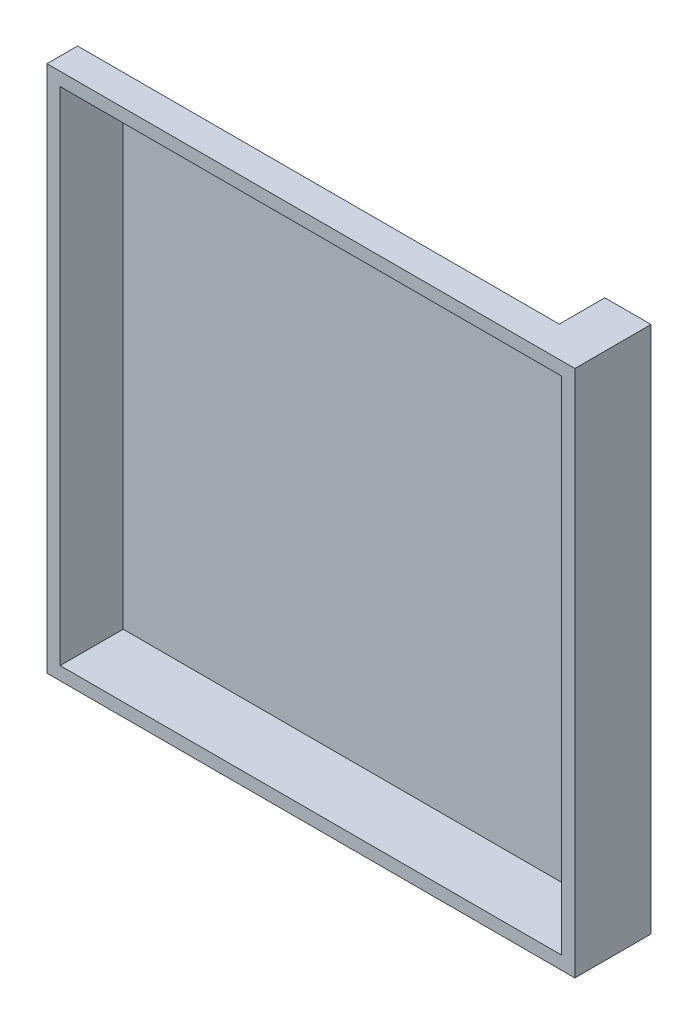
ISO-10303-21;
HEADER;
FILE_DESCRIPTION(('STEP AP214'),'2;1');
FILE_NAME('part.step','',(''),(''),'','','');
FILE_SCHEMA(('AUTOMOTIVE_DESIGN { 1 0 10303 214 1 1 1 1 }'));
ENDSEC;
DATA;
#1=APPLICATION_CONTEXT('core data for automotive mechanical design processes');
#2=APPLICATION_PROTOCOL_DEFINITION('international standard','automotive_design',2000,#1);
#3=PRODUCT_CONTEXT('',#1,'mechanical');
#4=PRODUCT('Part','Part','',(#3));
#5=PRODUCT_RELATED_PRODUCT_CATEGORY('part','',(#4));
#6=PRODUCT_DEFINITION_FORMATION('','',#4);
#7=PRODUCT_DEFINITION_CONTEXT('part definition',#1,'design');
#8=PRODUCT_DEFINITION('design','',#6,#7);
#9=PRODUCT_DEFINITION_SHAPE('','',#8);
#10=(LENGTH_UNIT() NAMED_UNIT(*) SI_UNIT(.MILLI.,.METRE.));
#11=(NAMED_UNIT(*) PLANE_ANGLE_UNIT() SI_UNIT($,.RADIAN.));
#12=(NAMED_UNIT(*) SI_UNIT($,.STERADIAN.) SOLID_ANGLE_UNIT());
#13=UNCERTAINTY_MEASURE_WITH_UNIT(LENGTH_MEASURE(1.E-05),#10,'distance_accuracy_value','');
#14=(GEOMETRIC_REPRESENTATION_CONTEXT(3) GLOBAL_UNCERTAINTY_ASSIGNED_CONTEXT((#13)) GLOBAL_UNIT_ASSIGNED_CONTEXT((#10,
#11,#12)) REPRESENTATION_CONTEXT('',''));
#15=CARTESIAN_POINT('',(0.,0.,0.));
#16=DIRECTION('',(0.,0.,1.));
#17=DIRECTION('',(1.,0.,0.));
#18=AXIS2_PLACEMENT_3D('',#15,#16,#17);
#19=CARTESIAN_POINT('',(-200.,-190.,1200.));
#20=DIRECTION('',(0.,1.,0.));
#21=DIRECTION('',(0.,0.,1.));
#22=AXIS2_PLACEMENT_3D('',#19,#20,#21);
#23=PLANE('',#22);
#24=DIRECTION('',(0.,0.,-1.));
#25=VECTOR('',#24,1.);
#26=CARTESIAN_POINT('',(190.,-190.,1200.));
#27=LINE('',#26,#25);
#28=CARTESIAN_POINT('',(190.,-190.,1200.));
#29=VERTEX_POINT('',#28);
#30=CARTESIAN_POINT('',(190.,-190.,1152.26497308104));
#31=VERTEX_POINT('',#30);
#32=EDGE_CURVE('E136',#29,#31,#27,.T.);
#33=ORIENTED_EDGE('',*,*,#32,.T.);
#34=DIRECTION('',(-1.,0.,0.));
#35=VECTOR('',#34,1.);
#36=CARTESIAN_POINT('',(-200.,-190.,1152.26497308104));
#37=LINE('',#36,#35);
#38=CARTESIAN_POINT('',(-190.,-190.,1152.26497308104));
#39=VERTEX_POINT('',#38);
#40=EDGE_CURVE('E145',#31,#39,#37,.T.);
#41=ORIENTED_EDGE('',*,*,#40,.T.);
#42=DIRECTION('',(0.,0.,-1.));
#43=VECTOR('',#42,1.);
#44=CARTESIAN_POINT('',(-190.,-190.,1200.));
#45=LINE('',#44,#43);
#46=CARTESIAN_POINT('',(-190.,-190.,1200.));
#47=VERTEX_POINT('',#46);
#48=EDGE_CURVE('E50',#47,#39,#45,.T.);
#49=ORIENTED_EDGE('',*,*,#48,.F.);
#50=DIRECTION('',(1.,0.,0.));
#51=VECTOR('',#50,1.);
#52=CARTESIAN_POINT('',(-200.,-190.,1200.));
#53=LINE('',#52,#51);
#54=EDGE_CURVE('E151',#47,#29,#53,.T.);
#55=ORIENTED_EDGE('',*,*,#54,.T.);
#56=EDGE_LOOP('',(#33,#41,#49,#55));
#57=FACE_BOUND('',#56,.T.);
#58=ADVANCED_FACE('F35',(#57),#23,.T.);
#59=CARTESIAN_POINT('',(190.,200.,1200.));
#60=DIRECTION('',(-1.,0.,0.));
#61=DIRECTION('',(0.,-1.,0.));
#62=AXIS2_PLACEMENT_3D('',#59,#60,#61);
#63=PLANE('',#62);
#64=DIRECTION('',(0.,1.,0.));
#65=VECTOR('',#64,1.);
#66=CARTESIAN_POINT('',(190.,200.,1152.26497308104));
#67=LINE('',#66,#65);
#68=CARTESIAN_POINT('',(190.,190.,1152.26497308104));
#69=VERTEX_POINT('',#68);
#70=EDGE_CURVE('E132',#31,#69,#67,.T.);
#71=ORIENTED_EDGE('',*,*,#70,.F.);
#72=ORIENTED_EDGE('',*,*,#32,.F.);
#73=DIRECTION('',(0.,1.,0.));
#74=VECTOR('',#73,1.);
#75=CARTESIAN_POINT('',(190.,200.,1200.));
#76=LINE('',#75,#74);
#77=CARTESIAN_POINT('',(190.,190.,1200.));
#78=VERTEX_POINT('',#77);
#79=EDGE_CURVE('E142',#29,#78,#76,.T.);
#80=ORIENTED_EDGE('',*,*,#79,.T.);
#81=DIRECTION('',(0.,0.,-1.));
#82=VECTOR('',#81,1.);
#83=CARTESIAN_POINT('',(190.,190.,1200.));
#84=LINE('',#83,#82);
#85=EDGE_CURVE('E139',#78,#69,#84,.T.);
#86=ORIENTED_EDGE('',*,*,#85,.T.);
#87=EDGE_LOOP('',(#71,#72,#80,#86));
#88=FACE_BOUND('',#87,.T.);
#89=ADVANCED_FACE('F134',(#88),#63,.T.);
#90=CARTESIAN_POINT('',(-190.,200.,1200.));
#91=DIRECTION('',(1.,0.,0.));
#92=DIRECTION('',(0.,1.,0.));
#93=AXIS2_PLACEMENT_3D('',#90,#91,#92);
#94=PLANE('',#93);
#95=ORIENTED_EDGE('',*,*,#48,.T.);
#96=DIRECTION('',(0.,1.,0.));
#97=VECTOR('',#96,1.);
#98=CARTESIAN_POINT('',(-190.,-100.,1152.26497308104));
#99=LINE('',#98,#97);
#100=CARTESIAN_POINT('',(-190.,155.265246170202,1152.26497308104));
#101=VERTEX_POINT('',#100);
#102=EDGE_CURVE('E143',#39,#101,#99,.T.);
#103=ORIENTED_EDGE('',*,*,#102,.T.);
#104=CARTESIAN_POINT('',(-190.,206.5,1132.26497308104));
#105=DIRECTION('',(1.,0.,0.));
#106=DIRECTION('',(0.,1.,0.));
#107=AXIS2_PLACEMENT_3D('',#104,#105,#106);
#108=CIRCLE('',#107,55.);
#109=CARTESIAN_POINT('',(-190.,190.,1184.73162915897));
#110=VERTEX_POINT('',#109);
#111=EDGE_CURVE('E161',#110,#101,#108,.T.);
#112=ORIENTED_EDGE('',*,*,#111,.F.);
#113=DIRECTION('',(0.,0.,-1.));
#114=VECTOR('',#113,1.);
#115=CARTESIAN_POINT('',(-190.,190.,1200.));
#116=LINE('',#115,#114);
#117=CARTESIAN_POINT('',(-190.,190.,1200.));
#118=VERTEX_POINT('',#117);
#119=EDGE_CURVE('E153',#118,#110,#116,.T.);
#120=ORIENTED_EDGE('',*,*,#119,.F.);
#121=DIRECTION('',(0.,-1.,0.));
#122=VECTOR('',#121,1.);
#123=CARTESIAN_POINT('',(-190.,200.,1200.));
#124=LINE('',#123,#122);
#125=EDGE_CURVE('E155',#118,#47,#124,.T.);
#126=ORIENTED_EDGE('',*,*,#125,.T.);
#127=EDGE_LOOP('',(#95,#103,#112,#120,#126));
#128=FACE_BOUND('',#127,.T.);
#129=ADVANCED_FACE('F260',(#128),#94,.T.);
#130=CARTESIAN_POINT('',(-200.,-200.,1200.));
#131=DIRECTION('',(0.,1.,0.));
#132=DIRECTION('',(0.,0.,1.));
#133=AXIS2_PLACEMENT_3D('',#130,#131,#132);
#134=PLANE('',#133);
#135=DIRECTION('',(0.,0.,-1.));
#136=VECTOR('',#135,1.);
#137=CARTESIAN_POINT('',(-200.,-200.,1200.));
#138=LINE('',#137,#136);
#139=CARTESIAN_POINT('',(-200.,-200.,1200.));
#140=VERTEX_POINT('',#139);
#141=CARTESIAN_POINT('',(-200.,-200.,1142.26497308104));
#142=VERTEX_POINT('',#141);
#143=EDGE_CURVE('E216',#140,#142,#138,.T.);
#144=ORIENTED_EDGE('',*,*,#143,.T.);
#145=DIRECTION('',(-1.,0.,0.));
#146=VECTOR('',#145,1.);
#147=CARTESIAN_POINT('',(-200.,-200.,1142.26497308104));
#148=LINE('',#147,#146);
#149=CARTESIAN_POINT('',(200.,-200.,1142.26497308104));
#150=VERTEX_POINT('',#149);
#151=EDGE_CURVE('E148',#150,#142,#148,.T.);
#152=ORIENTED_EDGE('',*,*,#151,.F.);
#153=DIRECTION('',(0.,0.,-1.));
#154=VECTOR('',#153,1.);
#155=CARTESIAN_POINT('',(200.,-200.,1200.));
#156=LINE('',#155,#154);
#157=CARTESIAN_POINT('',(200.,-200.,1200.));
#158=VERTEX_POINT('',#157);
#159=EDGE_CURVE('E213',#158,#150,#156,.T.);
#160=ORIENTED_EDGE('',*,*,#159,.F.);
#161=DIRECTION('',(1.,0.,0.));
#162=VECTOR('',#161,1.);
#163=CARTESIAN_POINT('',(-200.,-200.,1200.));
#164=LINE('',#163,#162);
#165=EDGE_CURVE('E211',#140,#158,#164,.T.);
#166=ORIENTED_EDGE('',*,*,#165,.F.);
#167=EDGE_LOOP('',(#144,#152,#160,#166));
#168=FACE_BOUND('',#167,.T.);
#169=ADVANCED_FACE('F258',(#168),#134,.F.);
#170=CARTESIAN_POINT('',(200.,200.,1200.));
#171=DIRECTION('',(-1.,0.,0.));
#172=DIRECTION('',(0.,-1.,0.));
#173=AXIS2_PLACEMENT_3D('',#170,#171,#172);
#174=PLANE('',#173);
#175=ORIENTED_EDGE('',*,*,#159,.T.);
#176=DIRECTION('',(0.,1.,0.));
#177=VECTOR('',#176,1.);
#178=CARTESIAN_POINT('',(200.,-100.,1142.26497308104));
#179=LINE('',#178,#177);
#180=CARTESIAN_POINT('',(200.,200.,1142.26497308104));
#181=VERTEX_POINT('',#180);
#182=EDGE_CURVE('E199',#150,#181,#179,.T.);
#183=ORIENTED_EDGE('',*,*,#182,.T.);
#184=DIRECTION('',(0.,0.,-1.));
#185=VECTOR('',#184,1.);
#186=CARTESIAN_POINT('',(200.,200.,1200.));
#187=LINE('',#186,#185);
#188=CARTESIAN_POINT('',(200.,200.,1200.));
#189=VERTEX_POINT('',#188);
#190=EDGE_CURVE('E222',#189,#181,#187,.T.);
#191=ORIENTED_EDGE('',*,*,#190,.F.);
#192=DIRECTION('',(0.,1.,0.));
#193=VECTOR('',#192,1.);
#194=CARTESIAN_POINT('',(200.,200.,1200.));
#195=LINE('',#194,#193);
#196=EDGE_CURVE('E202',#158,#189,#195,.T.);
#197=ORIENTED_EDGE('',*,*,#196,.F.);
#198=EDGE_LOOP('',(#175,#183,#191,#197));
#199=FACE_BOUND('',#198,.T.);
#200=ADVANCED_FACE('F256',(#199),#174,.F.);
#201=CARTESIAN_POINT('',(-200.,200.,1200.));
#202=DIRECTION('',(1.,0.,0.));
#203=DIRECTION('',(0.,1.,0.));
#204=AXIS2_PLACEMENT_3D('',#201,#202,#203);
#205=PLANE('',#204);
#206=DIRECTION('',(0.,1.,0.));
#207=VECTOR('',#206,1.);
#208=CARTESIAN_POINT('',(-200.,-100.,1142.26497308104));
#209=LINE('',#208,#207);
#210=CARTESIAN_POINT('',(-200.,155.265246170202,1142.26497308104));
#211=VERTEX_POINT('',#210);
#212=EDGE_CURVE('E198',#142,#211,#209,.T.);
#213=ORIENTED_EDGE('',*,*,#212,.F.);
#214=ORIENTED_EDGE('',*,*,#143,.F.);
#215=DIRECTION('',(0.,-1.,0.));
#216=VECTOR('',#215,1.);
#217=CARTESIAN_POINT('',(-200.,200.,1200.));
#218=LINE('',#217,#216);
#219=CARTESIAN_POINT('',(-200.,200.,1200.));
#220=VERTEX_POINT('',#219);
#221=EDGE_CURVE('E209',#220,#140,#218,.T.);
#222=ORIENTED_EDGE('',*,*,#221,.F.);
#223=DIRECTION('',(0.,0.,-1.));
#224=VECTOR('',#223,1.);
#225=CARTESIAN_POINT('',(-200.,200.,1200.));
#226=LINE('',#225,#224);
#227=CARTESIAN_POINT('',(-200.,200.,1176.79305410863));
#228=VERTEX_POINT('',#227);
#229=EDGE_CURVE('E219',#220,#228,#226,.T.);
#230=ORIENTED_EDGE('',*,*,#229,.T.);
#231=CARTESIAN_POINT('',(-200.,206.5,1132.26497308104));
#232=DIRECTION('',(1.,0.,0.));
#233=DIRECTION('',(0.,1.,0.));
#234=AXIS2_PLACEMENT_3D('',#231,#232,#233);
#235=CIRCLE('',#234,45.);
#236=CARTESIAN_POINT('',(-200.,164.580655957438,1148.62860944467));
#237=VERTEX_POINT('',#236);
#238=EDGE_CURVE('E194',#228,#237,#235,.T.);
#239=ORIENTED_EDGE('',*,*,#238,.T.);
#240=CARTESIAN_POINT('',(-200.,155.265246170202,1152.26497308104));
#241=DIRECTION('',(1.,0.,0.));
#242=DIRECTION('',(0.,1.,0.));
#243=AXIS2_PLACEMENT_3D('',#240,#241,#242);
#244=CIRCLE('',#243,10.);
#245=EDGE_CURVE('E43',#237,#211,#244,.F.);
#246=ORIENTED_EDGE('',*,*,#245,.T.);
#247=EDGE_LOOP('',(#213,#214,#222,#230,#239,#246));
#248=FACE_BOUND('',#247,.T.);
#249=ADVANCED_FACE('F231',(#248),#205,.F.);
#250=CARTESIAN_POINT('',(-200.,200.,1200.));
#251=DIRECTION('',(0.,-1.,0.));
#252=DIRECTION('',(0.,0.,-1.));
#253=AXIS2_PLACEMENT_3D('',#250,#251,#252);
#254=PLANE('',#253);
#255=DIRECTION('',(0.,0.,1.));
#256=VECTOR('',#255,1.);
#257=CARTESIAN_POINT('',(165.,200.,0.));
#258=LINE('',#257,#256);
#259=CARTESIAN_POINT('',(165.,200.,1142.26497308104));
#260=VERTEX_POINT('',#259);
#261=CARTESIAN_POINT('',(165.,200.,1176.79305410863));
#262=VERTEX_POINT('',#261);
#263=EDGE_CURVE('E177',#260,#262,#258,.T.);
#264=ORIENTED_EDGE('',*,*,#263,.T.);
#265=DIRECTION('',(1.,0.,0.));
#266=VECTOR('',#265,1.);
#267=CARTESIAN_POINT('',(-235.,200.,1176.79305410863));
#268=LINE('',#267,#266);
#269=EDGE_CURVE('E192',#228,#262,#268,.T.);
#270=ORIENTED_EDGE('',*,*,#269,.F.);
#271=ORIENTED_EDGE('',*,*,#229,.F.);
#272=DIRECTION('',(-1.,0.,0.));
#273=VECTOR('',#272,1.);
#274=CARTESIAN_POINT('',(-200.,200.,1200.));
#275=LINE('',#274,#273);
#276=EDGE_CURVE('E207',#189,#220,#275,.T.);
#277=ORIENTED_EDGE('',*,*,#276,.F.);
#278=ORIENTED_EDGE('',*,*,#190,.T.);
#279=DIRECTION('',(1.,0.,0.));
#280=VECTOR('',#279,1.);
#281=CARTESIAN_POINT('',(0.,200.,1142.26497308104));
#282=LINE('',#281,#280);
#283=EDGE_CURVE('E196',#260,#181,#282,.T.);
#284=ORIENTED_EDGE('',*,*,#283,.F.);
#285=EDGE_LOOP('',(#264,#270,#271,#277,#278,#284));
#286=FACE_BOUND('',#285,.T.);
#287=ADVANCED_FACE('F246',(#286),#254,.F.);
#288=CARTESIAN_POINT('',(0.,0.,1200.));
#289=DIRECTION('',(0.,0.,1.));
#290=DIRECTION('',(1.,0.,0.));
#291=AXIS2_PLACEMENT_3D('',#288,#289,#290);
#292=PLANE('',#291);
#293=ORIENTED_EDGE('',*,*,#79,.F.);
#294=ORIENTED_EDGE('',*,*,#54,.F.);
#295=ORIENTED_EDGE('',*,*,#125,.F.);
#296=DIRECTION('',(-1.,0.,0.));
#297=VECTOR('',#296,1.);
#298=CARTESIAN_POINT('',(-200.,190.,1200.));
#299=LINE('',#298,#297);
#300=EDGE_CURVE('E182',#78,#118,#299,.T.);
#301=ORIENTED_EDGE('',*,*,#300,.F.);
#302=EDGE_LOOP('',(#293,#294,#295,#301));
#303=FACE_BOUND('',#302,.T.);
#304=ORIENTED_EDGE('',*,*,#196,.T.);
#305=ORIENTED_EDGE('',*,*,#276,.T.);
#306=ORIENTED_EDGE('',*,*,#221,.T.);
#307=ORIENTED_EDGE('',*,*,#165,.T.);
#308=EDGE_LOOP('',(#304,#305,#306,#307));
#309=FACE_BOUND('',#308,.T.);
#310=ADVANCED_FACE('F251',(#303,#309),#292,.T.);
#311=CARTESIAN_POINT('',(0.,-100.,1142.26497308104));
#312=DIRECTION('',(0.,0.,1.));
#313=DIRECTION('',(1.,0.,0.));
#314=AXIS2_PLACEMENT_3D('',#311,#312,#313);
#315=PLANE('',#314);
#316=ORIENTED_EDGE('',*,*,#151,.T.);
#317=ORIENTED_EDGE('',*,*,#212,.T.);
#318=DIRECTION('',(1.,0.,0.));
#319=VECTOR('',#318,1.);
#320=CARTESIAN_POINT('',(0.,155.265246170202,1142.26497308104));
#321=LINE('',#320,#319);
#322=CARTESIAN_POINT('',(165.,155.265246170202,1142.26497308104));
#323=VERTEX_POINT('',#322);
#324=EDGE_CURVE('E225',#211,#323,#321,.T.);
#325=ORIENTED_EDGE('',*,*,#324,.T.);
#326=DIRECTION('',(0.,1.,0.));
#327=VECTOR('',#326,1.);
#328=CARTESIAN_POINT('',(165.,0.,1142.26497308104));
#329=LINE('',#328,#327);
#330=EDGE_CURVE('E189',#323,#260,#329,.T.);
#331=ORIENTED_EDGE('',*,*,#330,.T.);
#332=ORIENTED_EDGE('',*,*,#283,.T.);
#333=ORIENTED_EDGE('',*,*,#182,.F.);
#334=EDGE_LOOP('',(#316,#317,#325,#331,#332,#333));
#335=FACE_BOUND('',#334,.T.);
#336=ADVANCED_FACE('F236',(#335),#315,.F.);
#337=CARTESIAN_POINT('',(-235.,206.5,1132.26497308104));
#338=DIRECTION('',(1.,0.,0.));
#339=DIRECTION('',(0.,1.,0.));
#340=AXIS2_PLACEMENT_3D('',#337,#338,#339);
#341=CYLINDRICAL_SURFACE('',#340,45.);
#342=CARTESIAN_POINT('',(165.,206.5,1132.26497308104));
#343=DIRECTION('',(1.,0.,0.));
#344=DIRECTION('',(0.,1.,0.));
#345=AXIS2_PLACEMENT_3D('',#342,#343,#344);
#346=CIRCLE('',#345,45.);
#347=CARTESIAN_POINT('',(165.,164.580655957438,1148.62860944467));
#348=VERTEX_POINT('',#347);
#349=EDGE_CURVE('E187',#262,#348,#346,.T.);
#350=ORIENTED_EDGE('',*,*,#349,.T.);
#351=DIRECTION('',(1.,0.,0.));
#352=VECTOR('',#351,1.);
#353=CARTESIAN_POINT('',(-235.,164.580655957438,1148.62860944467));
#354=LINE('',#353,#352);
#355=EDGE_CURVE('E58',#348,#237,#354,.F.);
#356=ORIENTED_EDGE('',*,*,#355,.T.);
#357=ORIENTED_EDGE('',*,*,#238,.F.);
#358=ORIENTED_EDGE('',*,*,#269,.T.);
#359=EDGE_LOOP('',(#350,#356,#357,#358));
#360=FACE_BOUND('',#359,.T.);
#361=ADVANCED_FACE('F242',(#360),#341,.F.);
#362=CARTESIAN_POINT('',(165.,0.,0.));
#363=DIRECTION('',(1.,0.,0.));
#364=DIRECTION('',(0.,1.,0.));
#365=AXIS2_PLACEMENT_3D('',#362,#363,#364);
#366=PLANE('',#365);
#367=ORIENTED_EDGE('',*,*,#263,.F.);
#368=ORIENTED_EDGE('',*,*,#330,.F.);
#369=CARTESIAN_POINT('',(165.,155.265246170202,1152.26497308104));
#370=DIRECTION('',(1.,0.,0.));
#371=DIRECTION('',(0.,1.,0.));
#372=AXIS2_PLACEMENT_3D('',#369,#370,#371);
#373=CIRCLE('',#372,10.);
#374=EDGE_CURVE('E11',#323,#348,#373,.T.);
#375=ORIENTED_EDGE('',*,*,#374,.T.);
#376=ORIENTED_EDGE('',*,*,#349,.F.);
#377=EDGE_LOOP('',(#367,#368,#375,#376));
#378=FACE_BOUND('',#377,.T.);
#379=ADVANCED_FACE('F241',(#378),#366,.F.);
#380=CARTESIAN_POINT('',(-235.,155.265246170202,1152.26497308104));
#381=DIRECTION('',(1.,0.,0.));
#382=DIRECTION('',(0.,1.,0.));
#383=AXIS2_PLACEMENT_3D('',#380,#381,#382);
#384=CYLINDRICAL_SURFACE('',#383,10.);
#385=ORIENTED_EDGE('',*,*,#245,.F.);
#386=ORIENTED_EDGE('',*,*,#355,.F.);
#387=ORIENTED_EDGE('',*,*,#374,.F.);
#388=ORIENTED_EDGE('',*,*,#324,.F.);
#389=EDGE_LOOP('',(#385,#386,#387,#388));
#390=FACE_BOUND('',#389,.T.);
#391=ADVANCED_FACE('F37',(#390),#384,.T.);
#392=CARTESIAN_POINT('',(-200.,190.,1200.));
#393=DIRECTION('',(0.,-1.,0.));
#394=DIRECTION('',(0.,0.,-1.));
#395=AXIS2_PLACEMENT_3D('',#392,#393,#394);
#396=PLANE('',#395);
#397=DIRECTION('',(0.,0.,1.));
#398=VECTOR('',#397,1.);
#399=CARTESIAN_POINT('',(175.,190.,1200.));
#400=LINE('',#399,#398);
#401=CARTESIAN_POINT('',(175.,190.,1152.26497308104));
#402=VERTEX_POINT('',#401);
#403=CARTESIAN_POINT('',(175.,190.,1184.73162915897));
#404=VERTEX_POINT('',#403);
#405=EDGE_CURVE('E169',#402,#404,#400,.T.);
#406=ORIENTED_EDGE('',*,*,#405,.F.);
#407=DIRECTION('',(1.,0.,0.));
#408=VECTOR('',#407,1.);
#409=CARTESIAN_POINT('',(0.,190.,1152.26497308104));
#410=LINE('',#409,#408);
#411=EDGE_CURVE('E164',#402,#69,#410,.T.);
#412=ORIENTED_EDGE('',*,*,#411,.T.);
#413=ORIENTED_EDGE('',*,*,#85,.F.);
#414=ORIENTED_EDGE('',*,*,#300,.T.);
#415=ORIENTED_EDGE('',*,*,#119,.T.);
#416=DIRECTION('',(1.,0.,0.));
#417=VECTOR('',#416,1.);
#418=CARTESIAN_POINT('',(-190.,190.,1184.73162915897));
#419=LINE('',#418,#417);
#420=EDGE_CURVE('E165',#110,#404,#419,.T.);
#421=ORIENTED_EDGE('',*,*,#420,.T.);
#422=EDGE_LOOP('',(#406,#412,#413,#414,#415,#421));
#423=FACE_BOUND('',#422,.T.);
#424=ADVANCED_FACE('F277',(#423),#396,.T.);
#425=CARTESIAN_POINT('',(0.,-100.,1152.26497308104));
#426=DIRECTION('',(0.,0.,1.));
#427=DIRECTION('',(1.,0.,0.));
#428=AXIS2_PLACEMENT_3D('',#425,#426,#427);
#429=PLANE('',#428);
#430=ORIENTED_EDGE('',*,*,#102,.F.);
#431=ORIENTED_EDGE('',*,*,#40,.F.);
#432=ORIENTED_EDGE('',*,*,#70,.T.);
#433=ORIENTED_EDGE('',*,*,#411,.F.);
#434=DIRECTION('',(0.,1.,0.));
#435=VECTOR('',#434,1.);
#436=CARTESIAN_POINT('',(175.,-99.9999999999999,1152.26497308104));
#437=LINE('',#436,#435);
#438=CARTESIAN_POINT('',(175.,155.265246170202,1152.26497308104));
#439=VERTEX_POINT('',#438);
#440=EDGE_CURVE('E174',#439,#402,#437,.T.);
#441=ORIENTED_EDGE('',*,*,#440,.F.);
#442=DIRECTION('',(1.,0.,0.));
#443=VECTOR('',#442,1.);
#444=CARTESIAN_POINT('',(175.,155.265246170202,1152.26497308104));
#445=LINE('',#444,#443);
#446=EDGE_CURVE('E160',#439,#101,#445,.F.);
#447=ORIENTED_EDGE('',*,*,#446,.T.);
#448=EDGE_LOOP('',(#430,#431,#432,#433,#441,#447));
#449=FACE_BOUND('',#448,.T.);
#450=ADVANCED_FACE('F146',(#449),#429,.T.);
#451=CARTESIAN_POINT('',(-235.,206.5,1132.26497308104));
#452=DIRECTION('',(1.,0.,0.));
#453=DIRECTION('',(0.,1.,0.));
#454=AXIS2_PLACEMENT_3D('',#451,#452,#453);
#455=CYLINDRICAL_SURFACE('',#454,55.);
#456=CARTESIAN_POINT('',(175.,206.5,1132.26497308104));
#457=DIRECTION('',(1.,0.,0.));
#458=DIRECTION('',(0.,1.,0.));
#459=AXIS2_PLACEMENT_3D('',#456,#457,#458);
#460=CIRCLE('',#459,55.);
#461=EDGE_CURVE('E172',#404,#439,#460,.T.);
#462=ORIENTED_EDGE('',*,*,#461,.F.);
#463=ORIENTED_EDGE('',*,*,#420,.F.);
#464=ORIENTED_EDGE('',*,*,#111,.T.);
#465=ORIENTED_EDGE('',*,*,#446,.F.);
#466=EDGE_LOOP('',(#462,#463,#464,#465));
#467=FACE_BOUND('',#466,.T.);
#468=ADVANCED_FACE('F283',(#467),#455,.T.);
#469=CARTESIAN_POINT('',(175.,0.,0.));
#470=DIRECTION('',(1.,0.,0.));
#471=DIRECTION('',(0.,1.,0.));
#472=AXIS2_PLACEMENT_3D('',#469,#470,#471);
#473=PLANE('',#472);
#474=ORIENTED_EDGE('',*,*,#405,.T.);
#475=ORIENTED_EDGE('',*,*,#461,.T.);
#476=ORIENTED_EDGE('',*,*,#440,.T.);
#477=EDGE_LOOP('',(#474,#475,#476));
#478=FACE_BOUND('',#477,.T.);
#479=ADVANCED_FACE('F286',(#478),#473,.T.);
#480=CLOSED_SHELL('',(#58,#89,#129,#169,#200,#249,#287,#310,#336,#361,#379,#391,#424,#450,#468,#479));
#481=MANIFOLD_SOLID_BREP('B2',#480);
#482=ADVANCED_BREP_SHAPE_REPRESENTATION('',(#18,#481),#14);
#483=SHAPE_DEFINITION_REPRESENTATION(#9,#482);
ENDSEC;
END-ISO-10303-21;
